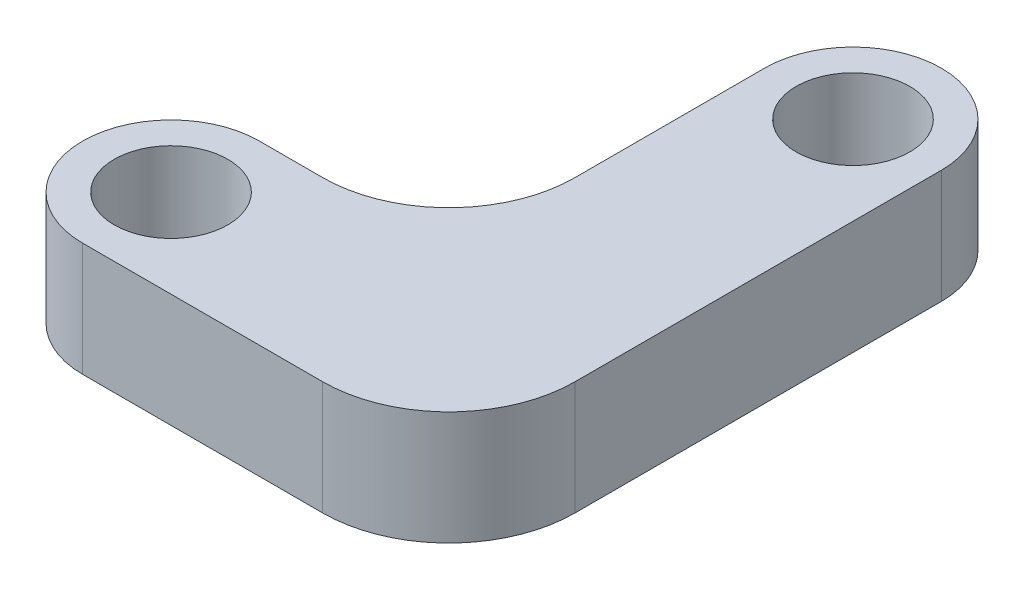
ISO-10303-21;
HEADER;
FILE_DESCRIPTION(('STEP AP214'),'2;1');
FILE_NAME('part.step','',(''),(''),'','','');
FILE_SCHEMA(('AUTOMOTIVE_DESIGN { 1 0 10303 214 1 1 1 1 }'));
ENDSEC;
DATA;
#1=APPLICATION_CONTEXT('core data for automotive mechanical design processes');
#2=APPLICATION_PROTOCOL_DEFINITION('international standard','automotive_design',2000,#1);
#3=PRODUCT_CONTEXT('',#1,'mechanical');
#4=PRODUCT('Part','Part','',(#3));
#5=PRODUCT_RELATED_PRODUCT_CATEGORY('part','',(#4));
#6=PRODUCT_DEFINITION_FORMATION('','',#4);
#7=PRODUCT_DEFINITION_CONTEXT('part definition',#1,'design');
#8=PRODUCT_DEFINITION('design','',#6,#7);
#9=PRODUCT_DEFINITION_SHAPE('','',#8);
#10=(LENGTH_UNIT() NAMED_UNIT(*) SI_UNIT(.MILLI.,.METRE.));
#11=(NAMED_UNIT(*) PLANE_ANGLE_UNIT() SI_UNIT($,.RADIAN.));
#12=(NAMED_UNIT(*) SI_UNIT($,.STERADIAN.) SOLID_ANGLE_UNIT());
#13=UNCERTAINTY_MEASURE_WITH_UNIT(LENGTH_MEASURE(1.E-05),#10,'distance_accuracy_value','');
#14=(GEOMETRIC_REPRESENTATION_CONTEXT(3) GLOBAL_UNCERTAINTY_ASSIGNED_CONTEXT((#13)) GLOBAL_UNIT_ASSIGNED_CONTEXT((#10,
#11,#12)) REPRESENTATION_CONTEXT('',''));
#15=CARTESIAN_POINT('',(0.,0.,0.));
#16=DIRECTION('',(0.,0.,1.));
#17=DIRECTION('',(1.,0.,0.));
#18=AXIS2_PLACEMENT_3D('',#15,#16,#17);
#19=CARTESIAN_POINT('',(-7.,-9.,25.));
#20=DIRECTION('',(1.,0.,0.));
#21=DIRECTION('',(0.,0.,-1.));
#22=AXIS2_PLACEMENT_3D('',#19,#20,#21);
#23=PLANE('',#22);
#24=DIRECTION('',(0.,0.,-1.));
#25=VECTOR('',#24,1.);
#26=CARTESIAN_POINT('',(-7.,-9.,25.));
#27=LINE('',#26,#25);
#28=CARTESIAN_POINT('',(-7.,-9.,15.));
#29=VERTEX_POINT('',#28);
#30=CARTESIAN_POINT('',(-7.,-9.,0.));
#31=VERTEX_POINT('',#30);
#32=EDGE_CURVE('E165',#29,#31,#27,.T.);
#33=ORIENTED_EDGE('',*,*,#32,.F.);
#34=DIRECTION('',(0.,-1.,0.));
#35=VECTOR('',#34,1.);
#36=CARTESIAN_POINT('',(-7.,0.,15.));
#37=LINE('',#36,#35);
#38=CARTESIAN_POINT('',(-7.,0.,15.));
#39=VERTEX_POINT('',#38);
#40=EDGE_CURVE('E180',#29,#39,#37,.F.);
#41=ORIENTED_EDGE('',*,*,#40,.T.);
#42=DIRECTION('',(0.,0.,-1.));
#43=VECTOR('',#42,1.);
#44=CARTESIAN_POINT('',(-7.,0.,25.));
#45=LINE('',#44,#43);
#46=CARTESIAN_POINT('',(-7.,0.,0.));
#47=VERTEX_POINT('',#46);
#48=EDGE_CURVE('E167',#39,#47,#45,.T.);
#49=ORIENTED_EDGE('',*,*,#48,.T.);
#50=DIRECTION('',(0.,-1.,0.));
#51=VECTOR('',#50,1.);
#52=CARTESIAN_POINT('',(-7.,-9.,0.));
#53=LINE('',#52,#51);
#54=EDGE_CURVE('E153',#47,#31,#53,.T.);
#55=ORIENTED_EDGE('',*,*,#54,.T.);
#56=EDGE_LOOP('',(#33,#41,#49,#55));
#57=FACE_BOUND('',#56,.T.);
#58=ADVANCED_FACE('F41',(#57),#23,.F.);
#59=CARTESIAN_POINT('',(7.,-9.,25.));
#60=DIRECTION('',(0.,1.,0.));
#61=DIRECTION('',(0.,0.,1.));
#62=AXIS2_PLACEMENT_3D('',#59,#60,#61);
#63=PLANE('',#62);
#64=CARTESIAN_POINT('',(0.,-9.,0.));
#65=DIRECTION('',(0.,1.,0.));
#66=DIRECTION('',(0.,0.,1.));
#67=AXIS2_PLACEMENT_3D('',#64,#65,#66);
#68=CIRCLE('',#67,4.5);
#69=CARTESIAN_POINT('',(0.,-9.,4.5));
#70=VERTEX_POINT('',#69);
#71=EDGE_CURVE('E144',#70,#70,#68,.T.);
#72=ORIENTED_EDGE('',*,*,#71,.T.);
#73=EDGE_LOOP('',(#72));
#74=FACE_BOUND('',#73,.T.);
#75=DIRECTION('',(0.,0.,-1.));
#76=VECTOR('',#75,1.);
#77=CARTESIAN_POINT('',(7.,-9.,25.));
#78=LINE('',#77,#76);
#79=CARTESIAN_POINT('',(7.,-9.,29.));
#80=VERTEX_POINT('',#79);
#81=CARTESIAN_POINT('',(7.,-9.,0.));
#82=VERTEX_POINT('',#81);
#83=EDGE_CURVE('E163',#80,#82,#78,.T.);
#84=ORIENTED_EDGE('',*,*,#83,.F.);
#85=CARTESIAN_POINT('',(-3.,-9.,29.));
#86=DIRECTION('',(0.,1.,0.));
#87=DIRECTION('',(0.,0.,1.));
#88=AXIS2_PLACEMENT_3D('',#85,#86,#87);
#89=CIRCLE('',#88,10.);
#90=CARTESIAN_POINT('',(-3.,-9.,39.));
#91=VERTEX_POINT('',#90);
#92=EDGE_CURVE('E176',#80,#91,#89,.F.);
#93=ORIENTED_EDGE('',*,*,#92,.T.);
#94=DIRECTION('',(1.,0.,0.));
#95=VECTOR('',#94,1.);
#96=CARTESIAN_POINT('',(7.,-9.,39.));
#97=LINE('',#96,#95);
#98=CARTESIAN_POINT('',(-22.,-9.,39.));
#99=VERTEX_POINT('',#98);
#100=EDGE_CURVE('E139',#99,#91,#97,.T.);
#101=ORIENTED_EDGE('',*,*,#100,.F.);
#102=CARTESIAN_POINT('',(-22.,-9.,32.));
#103=DIRECTION('',(0.,1.,0.));
#104=DIRECTION('',(0.,0.,1.));
#105=AXIS2_PLACEMENT_3D('',#102,#103,#104);
#106=CIRCLE('',#105,7.);
#107=CARTESIAN_POINT('',(-22.,-9.,25.));
#108=VERTEX_POINT('',#107);
#109=EDGE_CURVE('E114',#108,#99,#106,.T.);
#110=ORIENTED_EDGE('',*,*,#109,.F.);
#111=DIRECTION('',(1.,0.,0.));
#112=VECTOR('',#111,1.);
#113=CARTESIAN_POINT('',(-22.,-9.,25.));
#114=LINE('',#113,#112);
#115=CARTESIAN_POINT('',(-17.,-9.,25.));
#116=VERTEX_POINT('',#115);
#117=EDGE_CURVE('E108',#108,#116,#114,.T.);
#118=ORIENTED_EDGE('',*,*,#117,.T.);
#119=CARTESIAN_POINT('',(-17.,-9.,15.));
#120=DIRECTION('',(0.,1.,0.));
#121=DIRECTION('',(0.,0.,1.));
#122=AXIS2_PLACEMENT_3D('',#119,#120,#121);
#123=CIRCLE('',#122,10.);
#124=EDGE_CURVE('E49',#116,#29,#123,.T.);
#125=ORIENTED_EDGE('',*,*,#124,.T.);
#126=ORIENTED_EDGE('',*,*,#32,.T.);
#127=CARTESIAN_POINT('',(0.,-9.,0.));
#128=DIRECTION('',(0.,1.,0.));
#129=DIRECTION('',(0.,0.,1.));
#130=AXIS2_PLACEMENT_3D('',#127,#128,#129);
#131=CIRCLE('',#130,7.);
#132=EDGE_CURVE('E150',#82,#31,#131,.T.);
#133=ORIENTED_EDGE('',*,*,#132,.F.);
#134=EDGE_LOOP('',(#84,#93,#101,#110,#118,#125,#126,#133));
#135=FACE_BOUND('',#134,.T.);
#136=CARTESIAN_POINT('',(-22.,-9.,32.));
#137=DIRECTION('',(0.,1.,0.));
#138=DIRECTION('',(0.,0.,1.));
#139=AXIS2_PLACEMENT_3D('',#136,#137,#138);
#140=CIRCLE('',#139,4.5);
#141=CARTESIAN_POINT('',(-22.,-9.,36.5));
#142=VERTEX_POINT('',#141);
#143=EDGE_CURVE('E128',#142,#142,#140,.T.);
#144=ORIENTED_EDGE('',*,*,#143,.T.);
#145=EDGE_LOOP('',(#144));
#146=FACE_BOUND('',#145,.T.);
#147=ADVANCED_FACE('F185',(#74,#135,#146),#63,.F.);
#148=CARTESIAN_POINT('',(7.,0.,25.));
#149=DIRECTION('',(-1.,0.,0.));
#150=DIRECTION('',(0.,-1.,0.));
#151=AXIS2_PLACEMENT_3D('',#148,#149,#150);
#152=PLANE('',#151);
#153=DIRECTION('',(0.,0.,-1.));
#154=VECTOR('',#153,1.);
#155=CARTESIAN_POINT('',(7.,0.,25.));
#156=LINE('',#155,#154);
#157=CARTESIAN_POINT('',(7.,0.,29.));
#158=VERTEX_POINT('',#157);
#159=CARTESIAN_POINT('',(7.,0.,0.));
#160=VERTEX_POINT('',#159);
#161=EDGE_CURVE('E161',#158,#160,#156,.T.);
#162=ORIENTED_EDGE('',*,*,#161,.F.);
#163=DIRECTION('',(0.,1.,0.));
#164=VECTOR('',#163,1.);
#165=CARTESIAN_POINT('',(7.,-9.,29.));
#166=LINE('',#165,#164);
#167=EDGE_CURVE('E174',#158,#80,#166,.F.);
#168=ORIENTED_EDGE('',*,*,#167,.T.);
#169=ORIENTED_EDGE('',*,*,#83,.T.);
#170=DIRECTION('',(0.,1.,0.));
#171=VECTOR('',#170,1.);
#172=CARTESIAN_POINT('',(7.,0.,0.));
#173=LINE('',#172,#171);
#174=EDGE_CURVE('E158',#82,#160,#173,.T.);
#175=ORIENTED_EDGE('',*,*,#174,.T.);
#176=EDGE_LOOP('',(#162,#168,#169,#175));
#177=FACE_BOUND('',#176,.T.);
#178=ADVANCED_FACE('F195',(#177),#152,.F.);
#179=CARTESIAN_POINT('',(0.,0.,25.));
#180=DIRECTION('',(0.,-1.,0.));
#181=DIRECTION('',(0.,0.,-1.));
#182=AXIS2_PLACEMENT_3D('',#179,#180,#181);
#183=PLANE('',#182);
#184=CARTESIAN_POINT('',(0.,0.,0.));
#185=DIRECTION('',(0.,1.,0.));
#186=DIRECTION('',(0.,0.,1.));
#187=AXIS2_PLACEMENT_3D('',#184,#185,#186);
#188=CIRCLE('',#187,4.5);
#189=CARTESIAN_POINT('',(0.,0.,4.5));
#190=VERTEX_POINT('',#189);
#191=EDGE_CURVE('E142',#190,#190,#188,.T.);
#192=ORIENTED_EDGE('',*,*,#191,.F.);
#193=EDGE_LOOP('',(#192));
#194=FACE_BOUND('',#193,.T.);
#195=DIRECTION('',(1.,0.,0.));
#196=VECTOR('',#195,1.);
#197=CARTESIAN_POINT('',(7.,0.,39.));
#198=LINE('',#197,#196);
#199=CARTESIAN_POINT('',(-22.,0.,39.));
#200=VERTEX_POINT('',#199);
#201=CARTESIAN_POINT('',(-3.,0.,39.));
#202=VERTEX_POINT('',#201);
#203=EDGE_CURVE('E138',#200,#202,#198,.T.);
#204=ORIENTED_EDGE('',*,*,#203,.T.);
#205=CARTESIAN_POINT('',(-3.,0.,29.));
#206=DIRECTION('',(0.,-1.,0.));
#207=DIRECTION('',(0.,0.,-1.));
#208=AXIS2_PLACEMENT_3D('',#205,#206,#207);
#209=CIRCLE('',#208,10.);
#210=EDGE_CURVE('E172',#202,#158,#209,.F.);
#211=ORIENTED_EDGE('',*,*,#210,.T.);
#212=ORIENTED_EDGE('',*,*,#161,.T.);
#213=CARTESIAN_POINT('',(0.,0.,0.));
#214=DIRECTION('',(0.,1.,0.));
#215=DIRECTION('',(0.,0.,1.));
#216=AXIS2_PLACEMENT_3D('',#213,#214,#215);
#217=CIRCLE('',#216,7.);
#218=EDGE_CURVE('E147',#160,#47,#217,.T.);
#219=ORIENTED_EDGE('',*,*,#218,.T.);
#220=ORIENTED_EDGE('',*,*,#48,.F.);
#221=CARTESIAN_POINT('',(-17.,0.,15.));
#222=DIRECTION('',(0.,-1.,0.));
#223=DIRECTION('',(0.,0.,-1.));
#224=AXIS2_PLACEMENT_3D('',#221,#222,#223);
#225=CIRCLE('',#224,10.);
#226=CARTESIAN_POINT('',(-17.,0.,25.));
#227=VERTEX_POINT('',#226);
#228=EDGE_CURVE('E11',#39,#227,#225,.T.);
#229=ORIENTED_EDGE('',*,*,#228,.T.);
#230=DIRECTION('',(1.,0.,0.));
#231=VECTOR('',#230,1.);
#232=CARTESIAN_POINT('',(-22.,0.,25.));
#233=LINE('',#232,#231);
#234=CARTESIAN_POINT('',(-22.,0.,25.));
#235=VERTEX_POINT('',#234);
#236=EDGE_CURVE('E107',#235,#227,#233,.T.);
#237=ORIENTED_EDGE('',*,*,#236,.F.);
#238=CARTESIAN_POINT('',(-22.,0.,32.));
#239=DIRECTION('',(0.,1.,0.));
#240=DIRECTION('',(0.,0.,1.));
#241=AXIS2_PLACEMENT_3D('',#238,#239,#240);
#242=CIRCLE('',#241,7.);
#243=EDGE_CURVE('E121',#235,#200,#242,.T.);
#244=ORIENTED_EDGE('',*,*,#243,.T.);
#245=EDGE_LOOP('',(#204,#211,#212,#219,#220,#229,#237,#244));
#246=FACE_BOUND('',#245,.T.);
#247=CARTESIAN_POINT('',(-22.,0.,32.));
#248=DIRECTION('',(0.,1.,0.));
#249=DIRECTION('',(0.,0.,1.));
#250=AXIS2_PLACEMENT_3D('',#247,#248,#249);
#251=CIRCLE('',#250,4.5);
#252=CARTESIAN_POINT('',(-22.,0.,36.5));
#253=VERTEX_POINT('',#252);
#254=EDGE_CURVE('E132',#253,#253,#251,.T.);
#255=ORIENTED_EDGE('',*,*,#254,.F.);
#256=EDGE_LOOP('',(#255));
#257=FACE_BOUND('',#256,.T.);
#258=ADVANCED_FACE('F119',(#194,#246,#257),#183,.F.);
#259=CARTESIAN_POINT('',(0.,-9.,0.));
#260=DIRECTION('',(0.,1.,0.));
#261=DIRECTION('',(0.,0.,1.));
#262=AXIS2_PLACEMENT_3D('',#259,#260,#261);
#263=CYLINDRICAL_SURFACE('',#262,7.);
#264=ORIENTED_EDGE('',*,*,#218,.F.);
#265=ORIENTED_EDGE('',*,*,#174,.F.);
#266=ORIENTED_EDGE('',*,*,#132,.T.);
#267=ORIENTED_EDGE('',*,*,#54,.F.);
#268=EDGE_LOOP('',(#264,#265,#266,#267));
#269=FACE_BOUND('',#268,.T.);
#270=ADVANCED_FACE('F219',(#269),#263,.T.);
#271=CARTESIAN_POINT('',(0.,-9.,0.));
#272=DIRECTION('',(0.,1.,0.));
#273=DIRECTION('',(0.,0.,1.));
#274=AXIS2_PLACEMENT_3D('',#271,#272,#273);
#275=CYLINDRICAL_SURFACE('',#274,4.5);
#276=ORIENTED_EDGE('',*,*,#71,.F.);
#277=EDGE_LOOP('',(#276));
#278=FACE_BOUND('',#277,.T.);
#279=ORIENTED_EDGE('',*,*,#191,.T.);
#280=EDGE_LOOP('',(#279));
#281=FACE_BOUND('',#280,.T.);
#282=ADVANCED_FACE('F223',(#278,#281),#275,.F.);
#283=CARTESIAN_POINT('',(7.,-9.,39.));
#284=DIRECTION('',(0.,0.,1.));
#285=DIRECTION('',(0.,-1.,0.));
#286=AXIS2_PLACEMENT_3D('',#283,#284,#285);
#287=PLANE('',#286);
#288=ORIENTED_EDGE('',*,*,#100,.T.);
#289=DIRECTION('',(0.,1.,0.));
#290=VECTOR('',#289,1.);
#291=CARTESIAN_POINT('',(-3.,0.,39.));
#292=LINE('',#291,#290);
#293=EDGE_CURVE('E169',#91,#202,#292,.T.);
#294=ORIENTED_EDGE('',*,*,#293,.T.);
#295=ORIENTED_EDGE('',*,*,#203,.F.);
#296=DIRECTION('',(0.,1.,0.));
#297=VECTOR('',#296,1.);
#298=CARTESIAN_POINT('',(-22.,-9.,39.));
#299=LINE('',#298,#297);
#300=EDGE_CURVE('E113',#99,#200,#299,.T.);
#301=ORIENTED_EDGE('',*,*,#300,.F.);
#302=EDGE_LOOP('',(#288,#294,#295,#301));
#303=FACE_BOUND('',#302,.T.);
#304=ADVANCED_FACE('F190',(#303),#287,.T.);
#305=CARTESIAN_POINT('',(-22.,0.,25.));
#306=DIRECTION('',(0.,0.,1.));
#307=DIRECTION('',(1.,0.,0.));
#308=AXIS2_PLACEMENT_3D('',#305,#306,#307);
#309=PLANE('',#308);
#310=ORIENTED_EDGE('',*,*,#236,.T.);
#311=DIRECTION('',(0.,-1.,0.));
#312=VECTOR('',#311,1.);
#313=CARTESIAN_POINT('',(-17.,-9.,25.));
#314=LINE('',#313,#312);
#315=EDGE_CURVE('E178',#227,#116,#314,.T.);
#316=ORIENTED_EDGE('',*,*,#315,.T.);
#317=ORIENTED_EDGE('',*,*,#117,.F.);
#318=DIRECTION('',(0.,-1.,0.));
#319=VECTOR('',#318,1.);
#320=CARTESIAN_POINT('',(-22.,0.,25.));
#321=LINE('',#320,#319);
#322=EDGE_CURVE('E104',#235,#108,#321,.T.);
#323=ORIENTED_EDGE('',*,*,#322,.F.);
#324=EDGE_LOOP('',(#310,#316,#317,#323));
#325=FACE_BOUND('',#324,.T.);
#326=ADVANCED_FACE('F106',(#325),#309,.F.);
#327=CARTESIAN_POINT('',(-22.,-9.,32.));
#328=DIRECTION('',(0.,1.,0.));
#329=DIRECTION('',(0.,0.,1.));
#330=AXIS2_PLACEMENT_3D('',#327,#328,#329);
#331=CYLINDRICAL_SURFACE('',#330,7.);
#332=ORIENTED_EDGE('',*,*,#243,.F.);
#333=ORIENTED_EDGE('',*,*,#322,.T.);
#334=ORIENTED_EDGE('',*,*,#109,.T.);
#335=ORIENTED_EDGE('',*,*,#300,.T.);
#336=EDGE_LOOP('',(#332,#333,#334,#335));
#337=FACE_BOUND('',#336,.T.);
#338=ADVANCED_FACE('F126',(#337),#331,.T.);
#339=CARTESIAN_POINT('',(-22.,-9.,32.));
#340=DIRECTION('',(0.,1.,0.));
#341=DIRECTION('',(0.,0.,1.));
#342=AXIS2_PLACEMENT_3D('',#339,#340,#341);
#343=CYLINDRICAL_SURFACE('',#342,4.5);
#344=ORIENTED_EDGE('',*,*,#143,.F.);
#345=EDGE_LOOP('',(#344));
#346=FACE_BOUND('',#345,.T.);
#347=ORIENTED_EDGE('',*,*,#254,.T.);
#348=EDGE_LOOP('',(#347));
#349=FACE_BOUND('',#348,.T.);
#350=ADVANCED_FACE('F199',(#346,#349),#343,.F.);
#351=CARTESIAN_POINT('',(-3.,-9.,29.));
#352=DIRECTION('',(0.,-1.,0.));
#353=DIRECTION('',(1.,0.,0.));
#354=AXIS2_PLACEMENT_3D('',#351,#352,#353);
#355=CYLINDRICAL_SURFACE('',#354,10.);
#356=ORIENTED_EDGE('',*,*,#92,.F.);
#357=ORIENTED_EDGE('',*,*,#167,.F.);
#358=ORIENTED_EDGE('',*,*,#210,.F.);
#359=ORIENTED_EDGE('',*,*,#293,.F.);
#360=EDGE_LOOP('',(#356,#357,#358,#359));
#361=FACE_BOUND('',#360,.T.);
#362=ADVANCED_FACE('F197',(#361),#355,.T.);
#363=CARTESIAN_POINT('',(-17.,0.,15.));
#364=DIRECTION('',(0.,1.,0.));
#365=DIRECTION('',(0.,0.,1.));
#366=AXIS2_PLACEMENT_3D('',#363,#364,#365);
#367=CYLINDRICAL_SURFACE('',#366,10.);
#368=ORIENTED_EDGE('',*,*,#228,.F.);
#369=ORIENTED_EDGE('',*,*,#40,.F.);
#370=ORIENTED_EDGE('',*,*,#124,.F.);
#371=ORIENTED_EDGE('',*,*,#315,.F.);
#372=EDGE_LOOP('',(#368,#369,#370,#371));
#373=FACE_BOUND('',#372,.T.);
#374=ADVANCED_FACE('F43',(#373),#367,.F.);
#375=CLOSED_SHELL('',(#58,#147,#178,#258,#270,#282,#304,#326,#338,#350,#362,#374));
#376=MANIFOLD_SOLID_BREP('B2',#375);
#377=ADVANCED_BREP_SHAPE_REPRESENTATION('',(#18,#376),#14);
#378=SHAPE_DEFINITION_REPRESENTATION(#9,#377);
ENDSEC;
END-ISO-10303-21;
